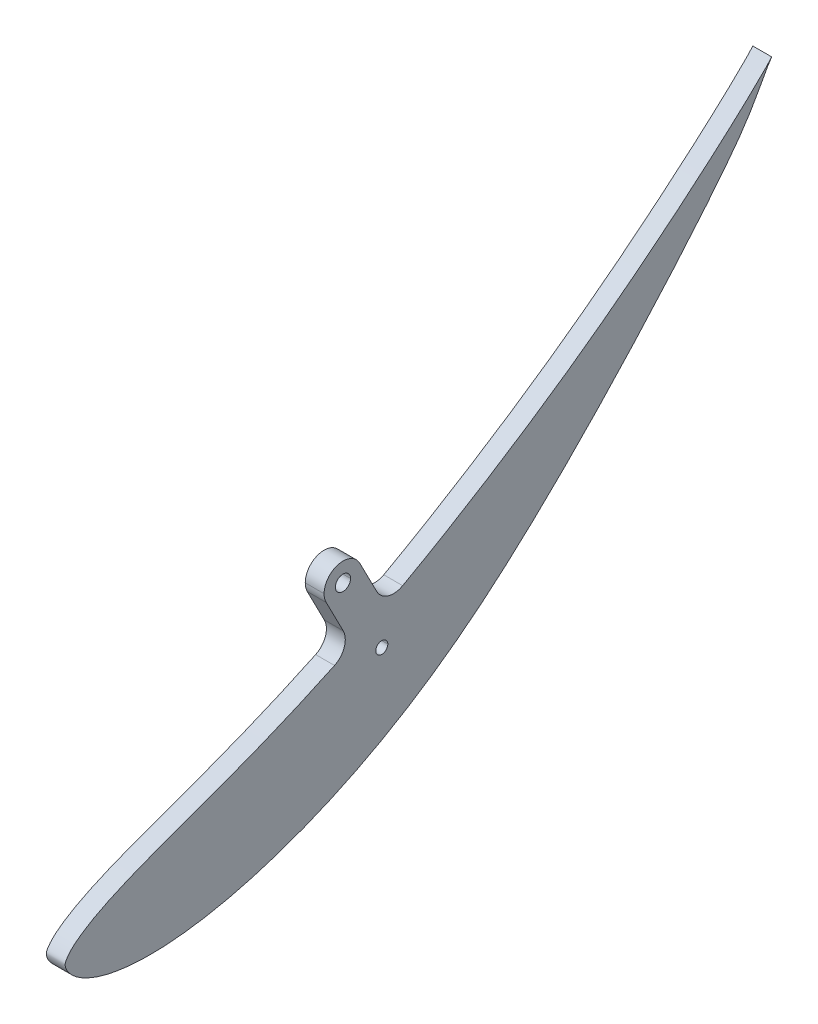
ISO-10303-21;
HEADER;
FILE_DESCRIPTION(('STEP AP214'),'2;1');
FILE_NAME('part.step','',(''),(''),'','','');
FILE_SCHEMA(('AUTOMOTIVE_DESIGN { 1 0 10303 214 1 1 1 1 }'));
ENDSEC;
DATA;
#1=APPLICATION_CONTEXT('core data for automotive mechanical design processes');
#2=APPLICATION_PROTOCOL_DEFINITION('international standard','automotive_design',2000,#1);
#3=PRODUCT_CONTEXT('',#1,'mechanical');
#4=PRODUCT('Part','Part','',(#3));
#5=PRODUCT_RELATED_PRODUCT_CATEGORY('part','',(#4));
#6=PRODUCT_DEFINITION_FORMATION('','',#4);
#7=PRODUCT_DEFINITION_CONTEXT('part definition',#1,'design');
#8=PRODUCT_DEFINITION('design','',#6,#7);
#9=PRODUCT_DEFINITION_SHAPE('','',#8);
#10=(LENGTH_UNIT() NAMED_UNIT(*) SI_UNIT(.MILLI.,.METRE.));
#11=(NAMED_UNIT(*) PLANE_ANGLE_UNIT() SI_UNIT($,.RADIAN.));
#12=(NAMED_UNIT(*) SI_UNIT($,.STERADIAN.) SOLID_ANGLE_UNIT());
#13=UNCERTAINTY_MEASURE_WITH_UNIT(LENGTH_MEASURE(1.E-05),#10,'distance_accuracy_value','');
#14=(GEOMETRIC_REPRESENTATION_CONTEXT(3) GLOBAL_UNCERTAINTY_ASSIGNED_CONTEXT((#13)) GLOBAL_UNIT_ASSIGNED_CONTEXT((#10,
#11,#12)) REPRESENTATION_CONTEXT('',''));
#15=CARTESIAN_POINT('',(0.,0.,0.));
#16=DIRECTION('',(0.,0.,1.));
#17=DIRECTION('',(1.,0.,0.));
#18=AXIS2_PLACEMENT_3D('',#15,#16,#17);
#19=CARTESIAN_POINT('',(-490.625999952,1029.97,-1002.03));
#20=DIRECTION('',(1.,0.,0.));
#21=DIRECTION('',(0.,0.,-1.));
#22=AXIS2_PLACEMENT_3D('',#19,#20,#21);
#23=CYLINDRICAL_SURFACE('',#22,2.01929999999994);
#24=DIRECTION('',(1.,0.,0.));
#25=VECTOR('',#24,1.);
#26=CARTESIAN_POINT('',(-490.625999952,1029.97,-1000.0107));
#27=LINE('',#26,#25);
#28=CARTESIAN_POINT('',(-3.175,1029.97,-1000.0107));
#29=VERTEX_POINT('',#28);
#30=CARTESIAN_POINT('',(3.175,1029.97,-1000.0107));
#31=VERTEX_POINT('',#30);
#32=EDGE_CURVE('E334',#29,#31,#27,.T.);
#33=ORIENTED_EDGE('',*,*,#32,.F.);
#34=CARTESIAN_POINT('',(-3.175,1029.97,-1002.03));
#35=DIRECTION('',(-1.,0.,0.));
#36=DIRECTION('',(0.,0.,-1.));
#37=AXIS2_PLACEMENT_3D('',#34,#35,#36);
#38=CIRCLE('',#37,2.01929999999994);
#39=CARTESIAN_POINT('',(-3.175,1029.97,-1004.0493));
#40=VERTEX_POINT('',#39);
#41=EDGE_CURVE('E11',#29,#40,#38,.T.);
#42=ORIENTED_EDGE('',*,*,#41,.T.);
#43=DIRECTION('',(1.,0.,0.));
#44=VECTOR('',#43,1.);
#45=CARTESIAN_POINT('',(-490.625999952,1029.97,-1004.0493));
#46=LINE('',#45,#44);
#47=CARTESIAN_POINT('',(3.175,1029.97,-1004.0493));
#48=VERTEX_POINT('',#47);
#49=EDGE_CURVE('E322',#40,#48,#46,.T.);
#50=ORIENTED_EDGE('',*,*,#49,.T.);
#51=CARTESIAN_POINT('',(3.175,1029.97,-1002.03));
#52=DIRECTION('',(1.,0.,0.));
#53=DIRECTION('',(0.,0.,-1.));
#54=AXIS2_PLACEMENT_3D('',#51,#52,#53);
#55=CIRCLE('',#54,2.01929999999994);
#56=EDGE_CURVE('E273',#48,#31,#55,.T.);
#57=ORIENTED_EDGE('',*,*,#56,.T.);
#58=EDGE_LOOP('',(#33,#42,#50,#57));
#59=FACE_BOUND('',#58,.T.);
#60=ADVANCED_FACE('F17',(#59),#23,.F.);
#61=CARTESIAN_POINT('',(0.,1038.43152102921,-983.391341109944));
#62=DIRECTION('',(-1.,0.,0.));
#63=DIRECTION('',(0.,0.,1.));
#64=AXIS2_PLACEMENT_3D('',#61,#62,#63);
#65=CYLINDRICAL_SURFACE('',#64,6.35);
#66=CARTESIAN_POINT('',(3.175,1038.43152102921,-983.391341109944));
#67=DIRECTION('',(-1.,0.,0.));
#68=DIRECTION('',(0.,0.,-1.));
#69=AXIS2_PLACEMENT_3D('',#66,#67,#68);
#70=CIRCLE('',#69,6.35);
#71=CARTESIAN_POINT('',(3.175,1041.33753556229,-989.037364447972));
#72=VERTEX_POINT('',#71);
#73=CARTESIAN_POINT('',(3.175,1032.69501889045,-986.114398805244));
#74=VERTEX_POINT('',#73);
#75=EDGE_CURVE('E155',#72,#74,#70,.T.);
#76=ORIENTED_EDGE('',*,*,#75,.F.);
#77=DIRECTION('',(1.,0.,0.));
#78=VECTOR('',#77,1.);
#79=CARTESIAN_POINT('',(3.175,1041.33753556229,-989.037364447972));
#80=LINE('',#79,#78);
#81=CARTESIAN_POINT('',(-3.175,1041.33753556229,-989.037364447972));
#82=VERTEX_POINT('',#81);
#83=EDGE_CURVE('E209',#82,#72,#80,.T.);
#84=ORIENTED_EDGE('',*,*,#83,.F.);
#85=CARTESIAN_POINT('',(-3.175,1038.43152102921,-983.391341109944));
#86=DIRECTION('',(1.,0.,0.));
#87=DIRECTION('',(0.,0.,-1.));
#88=AXIS2_PLACEMENT_3D('',#85,#86,#87);
#89=CIRCLE('',#88,6.35);
#90=CARTESIAN_POINT('',(-3.175,1032.69501889045,-986.114398805244));
#91=VERTEX_POINT('',#90);
#92=EDGE_CURVE('E25',#91,#82,#89,.T.);
#93=ORIENTED_EDGE('',*,*,#92,.F.);
#94=DIRECTION('',(-1.,0.,0.));
#95=VECTOR('',#94,1.);
#96=CARTESIAN_POINT('',(3.175,1032.69501889045,-986.114398805244));
#97=LINE('',#96,#95);
#98=EDGE_CURVE('E253',#74,#91,#97,.T.);
#99=ORIENTED_EDGE('',*,*,#98,.F.);
#100=EDGE_LOOP('',(#76,#84,#93,#99));
#101=FACE_BOUND('',#100,.T.);
#102=ADVANCED_FACE('F298',(#101),#65,.F.);
#103=CARTESIAN_POINT('',(0.,1050.04578660814,-1005.98047470024));
#104=DIRECTION('',(-1.,0.,0.));
#105=DIRECTION('',(0.,0.,1.));
#106=AXIS2_PLACEMENT_3D('',#103,#104,#105);
#107=CYLINDRICAL_SURFACE('',#106,6.35);
#108=CARTESIAN_POINT('',(3.175,1050.04578660814,-1005.98047470024));
#109=DIRECTION('',(-1.,0.,0.));
#110=DIRECTION('',(0.,0.,-1.));
#111=AXIS2_PLACEMENT_3D('',#108,#109,#110);
#112=CIRCLE('',#111,6.35000000000008);
#113=CARTESIAN_POINT('',(3.175,1044.48707475236,-1009.05020148033));
#114=VERTEX_POINT('',#113);
#115=CARTESIAN_POINT('',(3.175,1047.13977207507,-1000.33445136221));
#116=VERTEX_POINT('',#115);
#117=EDGE_CURVE('E49',#114,#116,#112,.T.);
#118=ORIENTED_EDGE('',*,*,#117,.F.);
#119=DIRECTION('',(1.,0.,0.));
#120=VECTOR('',#119,1.);
#121=CARTESIAN_POINT('',(-3.175,1044.48707475236,-1009.05020148033));
#122=LINE('',#121,#120);
#123=CARTESIAN_POINT('',(-3.175,1044.48707475236,-1009.05020148033));
#124=VERTEX_POINT('',#123);
#125=EDGE_CURVE('E182',#124,#114,#122,.T.);
#126=ORIENTED_EDGE('',*,*,#125,.F.);
#127=CARTESIAN_POINT('',(-3.175,1050.04578660814,-1005.98047470024));
#128=DIRECTION('',(1.,0.,0.));
#129=DIRECTION('',(0.,0.,-1.));
#130=AXIS2_PLACEMENT_3D('',#127,#128,#129);
#131=CIRCLE('',#130,6.35000000000008);
#132=CARTESIAN_POINT('',(-3.175,1047.13977207507,-1000.33445136221));
#133=VERTEX_POINT('',#132);
#134=EDGE_CURVE('E38',#133,#124,#131,.T.);
#135=ORIENTED_EDGE('',*,*,#134,.F.);
#136=DIRECTION('',(-1.,0.,0.));
#137=VECTOR('',#136,1.);
#138=CARTESIAN_POINT('',(3.175,1047.13977207507,-1000.33445136221));
#139=LINE('',#138,#137);
#140=EDGE_CURVE('E272',#116,#133,#139,.T.);
#141=ORIENTED_EDGE('',*,*,#140,.F.);
#142=EDGE_LOOP('',(#118,#126,#135,#141));
#143=FACE_BOUND('',#142,.T.);
#144=ADVANCED_FACE('F501',(#143),#107,.F.);
#145=CARTESIAN_POINT('',(-3.175,0.,0.));
#146=DIRECTION('',(1.,0.,0.));
#147=DIRECTION('',(0.,1.,0.));
#148=AXIS2_PLACEMENT_3D('',#145,#146,#147);
#149=PLANE('',#148);
#150=CARTESIAN_POINT('',(-3.175,1055.35569401965,-988.963954867594));
#151=DIRECTION('',(1.,0.,0.));
#152=DIRECTION('',(0.,0.,-1.));
#153=AXIS2_PLACEMENT_3D('',#150,#151,#152);
#154=CIRCLE('',#153,2.55269999999985);
#155=CARTESIAN_POINT('',(-3.175,1055.35569401965,-986.411254867594));
#156=VERTEX_POINT('',#155);
#157=CARTESIAN_POINT('',(-3.175,1055.35569401965,-991.516654867594));
#158=VERTEX_POINT('',#157);
#159=EDGE_CURVE('E150',#156,#158,#154,.T.);
#160=ORIENTED_EDGE('',*,*,#159,.T.);
#161=CARTESIAN_POINT('',(-3.175,1055.35569401965,-988.963954867594));
#162=DIRECTION('',(1.,0.,0.));
#163=DIRECTION('',(0.,0.,-1.));
#164=AXIS2_PLACEMENT_3D('',#161,#162,#163);
#165=CIRCLE('',#164,2.55269999999985);
#166=EDGE_CURVE('E145',#158,#156,#165,.T.);
#167=ORIENTED_EDGE('',*,*,#166,.T.);
#168=EDGE_LOOP('',(#160,#167));
#169=FACE_BOUND('',#168,.T.);
#170=CARTESIAN_POINT('',(-3.175,1029.97,-1002.03));
#171=DIRECTION('',(-1.,0.,0.));
#172=DIRECTION('',(0.,0.,-1.));
#173=AXIS2_PLACEMENT_3D('',#170,#171,#172);
#174=CIRCLE('',#173,2.01929999999994);
#175=EDGE_CURVE('E342',#40,#29,#174,.T.);
#176=ORIENTED_EDGE('',*,*,#175,.F.);
#177=ORIENTED_EDGE('',*,*,#41,.F.);
#178=EDGE_LOOP('',(#176,#177));
#179=FACE_BOUND('',#178,.T.);
#180=CARTESIAN_POINT('',(-3.175,1055.35569401965,-988.963954867594));
#181=DIRECTION('',(1.,0.,0.));
#182=DIRECTION('',(0.,0.,-1.));
#183=AXIS2_PLACEMENT_3D('',#180,#181,#182);
#184=CIRCLE('',#183,6.34999999999986);
#185=CARTESIAN_POINT('',(-3.175,1058.26170855273,-994.609978205623));
#186=VERTEX_POINT('',#185);
#187=CARTESIAN_POINT('',(-3.175,1055.35569401965,-982.613954867594));
#188=VERTEX_POINT('',#187);
#189=EDGE_CURVE('E242',#186,#188,#184,.T.);
#190=ORIENTED_EDGE('',*,*,#189,.F.);
#191=DIRECTION('',(0.,-0.889137533547774,-0.457640083948708));
#192=VECTOR('',#191,1.);
#193=CARTESIAN_POINT('',(-3.175,626.348203924365,-1216.91634258551));
#194=LINE('',#193,#192);
#195=EDGE_CURVE('E279',#186,#133,#194,.T.);
#196=ORIENTED_EDGE('',*,*,#195,.T.);
#197=ORIENTED_EDGE('',*,*,#134,.T.);
#198=CARTESIAN_POINT('',(-3.175,1136.500000046,-1133.2478951966));
#199=CARTESIAN_POINT('',(-3.175,1136.51866205503,-1133.22940707));
#200=CARTESIAN_POINT('',(-3.175,1134.76729407548,-1131.73738322467));
#201=CARTESIAN_POINT('',(-3.175,1133.14865361785,-1130.04521312581));
#202=CARTESIAN_POINT('',(-3.175,1129.16246906123,-1126.03283655878));
#203=CARTESIAN_POINT('',(-3.175,1124.47580071429,-1120.93333634314));
#204=CARTESIAN_POINT('',(-3.175,1118.44426676079,-1114.21213755127));
#205=CARTESIAN_POINT('',(-3.175,1111.46914157634,-1106.14181380977));
#206=CARTESIAN_POINT('',(-3.175,1103.59085152631,-1096.66531267338));
#207=CARTESIAN_POINT('',(-3.175,1094.99661592395,-1085.87423454851));
#208=CARTESIAN_POINT('',(-3.175,1085.8664057438,-1073.8426942592));
#209=CARTESIAN_POINT('',(-3.175,1076.45564659389,-1060.67966671591));
#210=CARTESIAN_POINT('',(-3.175,1066.99203007372,-1046.56526822842));
#211=CARTESIAN_POINT('',(-3.175,1057.62710879863,-1031.73778080715));
#212=CARTESIAN_POINT('',(-3.175,1050.14861006831,-1019.14642604003));
#213=CARTESIAN_POINT('',(-3.175,1045.84195399569,-1011.50363914843));
#214=CARTESIAN_POINT('',(-3.175,1044.48707475236,-1009.05020148033));
#215=(BOUNDED_CURVE() B_SPLINE_CURVE(3,(#198,#199,#200,#201,#202,#203,#204,#205,#206,#207,#208,
#209,#210,#211,#212,#213,#214),.UNSPECIFIED.,.F.,.F.) B_SPLINE_CURVE_WITH_KNOTS((4,1,1,1,1,1,1,
1,1,1,1,1,1,1,4),(0.,0.00184117619079416,0.00730848433221432,0.016237150684669,
0.0284563248120514,0.0438013684366982,0.0621258274692258,0.0832395532130718,0.106895519252796,
0.132816624078713,0.160612712000671,0.189791010160819,0.219873156169979,0.250457487037601,
0.264816751171415),
.UNSPECIFIED.) CURVE() GEOMETRIC_REPRESENTATION_ITEM() RATIONAL_B_SPLINE_CURVE((1.,1.,1.,1.,1.,
1.,1.,1.,1.,1.,1.,1.,1.,1.,1.,1.,1.)) REPRESENTATION_ITEM(''));
#216=CARTESIAN_POINT('',(-3.175,1136.500000046,-1133.2478951966));
#217=VERTEX_POINT('',#216);
#218=EDGE_CURVE('E178',#217,#124,#215,.T.);
#219=ORIENTED_EDGE('',*,*,#218,.F.);
#220=CARTESIAN_POINT('',(-3.175,983.23183406811,-902.866032271416));
#221=CARTESIAN_POINT('',(-3.175,983.051794016204,-903.245654519471));
#222=CARTESIAN_POINT('',(-3.175,982.193962185146,-905.174738908225));
#223=CARTESIAN_POINT('',(-3.175,980.947491558145,-909.044621195438));
#224=CARTESIAN_POINT('',(-3.175,979.870416154282,-914.795542365219));
#225=CARTESIAN_POINT('',(-3.175,979.346135741337,-921.395591653794));
#226=CARTESIAN_POINT('',(-3.175,979.429810957453,-928.776843337677));
#227=CARTESIAN_POINT('',(-3.175,980.159041889332,-936.860781778271));
#228=CARTESIAN_POINT('',(-3.175,981.563117839808,-945.564210018201));
#229=CARTESIAN_POINT('',(-3.175,983.658288216997,-954.794977359482));
#230=CARTESIAN_POINT('',(-3.175,986.455957132716,-964.453768835694));
#231=CARTESIAN_POINT('',(-3.175,989.95151803178,-974.43570168517));
#232=CARTESIAN_POINT('',(-3.175,994.146079418227,-984.631289751938));
#233=CARTESIAN_POINT('',(-3.175,999.067064719455,-994.928463859717));
#234=CARTESIAN_POINT('',(-3.175,1004.71077269264,-1005.23476562102));
#235=CARTESIAN_POINT('',(-3.175,1011.06861436425,-1015.47490404744));
#236=CARTESIAN_POINT('',(-3.175,1018.12967538531,-1025.5791208222));
#237=CARTESIAN_POINT('',(-3.175,1025.88232833701,-1035.50248612597));
#238=CARTESIAN_POINT('',(-3.175,1034.28184113422,-1045.21746008474));
#239=CARTESIAN_POINT('',(-3.175,1043.15012909835,-1054.77205505592));
#240=CARTESIAN_POINT('',(-3.175,1052.32466752318,-1064.1447414051));
#241=CARTESIAN_POINT('',(-3.175,1061.65160830308,-1073.25399801771));
#242=CARTESIAN_POINT('',(-3.175,1070.96289931065,-1082.02526393335));
#243=CARTESIAN_POINT('',(-3.175,1080.09941585938,-1090.37127690747));
#244=CARTESIAN_POINT('',(-3.175,1088.91431720843,-1098.19257457962));
#245=CARTESIAN_POINT('',(-3.175,1097.26041144891,-1105.39647498838));
#246=CARTESIAN_POINT('',(-3.175,1105.00816359892,-1111.87692251879));
#247=CARTESIAN_POINT('',(-3.175,1112.05162823055,-1117.54059155859));
#248=CARTESIAN_POINT('',(-3.175,1118.31282016739,-1122.28985209627));
#249=CARTESIAN_POINT('',(-3.175,1123.94756936492,-1126.05528055917));
#250=CARTESIAN_POINT('',(-3.175,1128.69826829572,-1128.73587721306));
#251=CARTESIAN_POINT('',(-3.175,1132.83122267032,-1131.03774052774));
#252=CARTESIAN_POINT('',(-3.175,1134.71203322922,-1132.01470797932));
#253=CARTESIAN_POINT('',(-3.175,1136.48162676212,-1133.26609728824));
#254=CARTESIAN_POINT('',(-3.175,1136.500000046,-1133.2478951966));
#255=(BOUNDED_CURVE() B_SPLINE_CURVE(3,(#220,#221,#222,#223,#224,#225,#226,#227,#228,#229,#230,
#231,#232,#233,#234,#235,#236,#237,#238,#239,#240,#241,#242,#243,#244,#245,#246,#247,#248,#249,
#250,#251,#252,#253,#254),.UNSPECIFIED.,.F.,.F.) B_SPLINE_CURVE_WITH_KNOTS((4,1,1,1,1,1,1,1,1,1,
1,1,1,1,1,1,1,1,1,1,1,1,1,1,1,1,1,1,1,1,1,1,4),(0.5,0.50214941417673,0.51079641033661,
0.52076411711489,0.532061880680993,0.544665778051845,0.558541303758952,0.573611819486058,
0.589802913486935,0.607010013605937,0.625106991651802,0.643966630087001,0.663469283837628,
0.683551422114583,0.704141715386998,0.725196116617036,0.746680344678811,0.76863295082579,
0.790977273416519,0.813463266282734,0.835826600861633,0.857771602761782,0.879002654996971,
0.899227861132971,0.918150719215499,0.935487384590744,0.950986920125746,0.964427757613896,
0.97582785740124,0.985423652020086,0.993088671814056,0.998187309160131,1.),
.UNSPECIFIED.) CURVE() GEOMETRIC_REPRESENTATION_ITEM() RATIONAL_B_SPLINE_CURVE((1.,1.,1.,1.,1.,
1.,1.,1.,1.,1.,1.,1.,1.,1.,1.,1.,1.,1.,1.,1.,1.,1.,1.,1.,1.,1.,1.,1.,1.,1.,1.,1.,1.,1.,1.)) REPRESENTATION_ITEM(''));
#256=CARTESIAN_POINT('',(-3.175,983.23183406811,-902.866032271416));
#257=VERTEX_POINT('',#256);
#258=EDGE_CURVE('E187',#257,#217,#255,.T.);
#259=ORIENTED_EDGE('',*,*,#258,.F.);
#260=CARTESIAN_POINT('',(-3.175,1032.69501889045,-986.114398805244));
#261=CARTESIAN_POINT('',(-3.175,1032.49497868821,-985.692986122752));
#262=CARTESIAN_POINT('',(-3.175,1029.89901787888,-980.198891522425));
#263=CARTESIAN_POINT('',(-3.175,1025.31827723405,-969.885579530069));
#264=CARTESIAN_POINT('',(-3.175,1019.49450613905,-955.489755196973));
#265=CARTESIAN_POINT('',(-3.175,1014.57372401878,-942.326496264695));
#266=CARTESIAN_POINT('',(-3.175,1010.42738715633,-930.668912346977));
#267=CARTESIAN_POINT('',(-3.175,1006.73545630894,-920.709876051195));
#268=CARTESIAN_POINT('',(-3.175,1003.30962973556,-912.488425414251));
#269=CARTESIAN_POINT('',(-3.175,1000.11328499534,-905.924711836648));
#270=CARTESIAN_POINT('',(-3.175,997.12209295586,-900.987613441477));
#271=CARTESIAN_POINT('',(-3.175,994.848485081599,-898.105542312802));
#272=CARTESIAN_POINT('',(-3.175,993.323061343934,-896.747220150379));
#273=CARTESIAN_POINT('',(-3.175,992.695678509163,-896.262963388353));
#274=CARTESIAN_POINT('',(-3.175,992.128471885305,-895.906132308792));
#275=CARTESIAN_POINT('',(-3.175,991.74202912273,-895.703357721575));
#276=CARTESIAN_POINT('',(-3.175,991.439913457428,-895.58976608859));
#277=CARTESIAN_POINT('',(-3.175,991.228782623257,-895.522464552237));
#278=CARTESIAN_POINT('',(-3.175,991.020214241511,-895.477266270503));
#279=CARTESIAN_POINT('',(-3.175,990.810606980497,-895.468104938629));
#280=CARTESIAN_POINT('',(-3.175,990.597176067395,-895.477187864337));
#281=CARTESIAN_POINT('',(-3.175,990.302571432088,-895.521281629362));
#282=CARTESIAN_POINT('',(-3.175,989.921640587498,-895.605761956951));
#283=CARTESIAN_POINT('',(-3.175,989.376327617136,-895.801661540054));
#284=CARTESIAN_POINT('',(-3.175,988.324502311541,-896.307224772996));
#285=CARTESIAN_POINT('',(-3.175,986.580020905351,-897.682020107552));
#286=CARTESIAN_POINT('',(-3.175,984.731799572414,-900.007794247464));
#287=CARTESIAN_POINT('',(-3.175,983.666890362432,-901.948697229946));
#288=CARTESIAN_POINT('',(-3.175,983.23183406811,-902.866032271416));
#289=(BOUNDED_CURVE() B_SPLINE_CURVE(3,(#260,#261,#262,#263,#264,#265,#266,#267,#268,#269,#270,
#271,#272,#273,#274,#275,#276,#277,#278,#279,#280,#281,#282,#283,#284,#285,#286,#287,#288),
.UNSPECIFIED.,.F.,.F.) B_SPLINE_CURVE_WITH_KNOTS((4,1,1,1,1,1,1,1,1,1,1,1,1,1,1,1,1,1,1,1,1,1,1,
1,1,1,4),(0.308866622963246,0.311256566368928,0.339998753430789,0.366671480309786,
0.390812035384013,0.411995107228008,0.430068720119567,0.445223789458553,0.457619352285403,
0.467425396221126,0.474786479626527,0.476279684730584,0.477883716925066,0.478839791717239,
0.479711359314481,0.480113154439697,0.480492023942477,0.48084645603417,0.481202586512776,
0.481563638127212,0.481939611769679,0.482727347846705,0.483558571629405,0.484902837311291,
0.488691658546686,0.494806065890377,0.5),
.UNSPECIFIED.) CURVE() GEOMETRIC_REPRESENTATION_ITEM() RATIONAL_B_SPLINE_CURVE((1.,1.,1.,1.,1.,
1.,1.,1.,1.,1.,1.,1.,1.,1.,1.,1.,1.,1.,1.,1.,1.,1.,1.,1.,1.,1.,1.,1.,1.)) REPRESENTATION_ITEM(''));
#290=EDGE_CURVE('E260',#91,#257,#289,.T.);
#291=ORIENTED_EDGE('',*,*,#290,.F.);
#292=ORIENTED_EDGE('',*,*,#92,.T.);
#293=DIRECTION('',(0.,-0.889137533547753,-0.45764008394875));
#294=VECTOR('',#293,1.);
#295=CARTESIAN_POINT('',(-3.175,620.536174858283,-1205.62429590944));
#296=LINE('',#295,#294);
#297=CARTESIAN_POINT('',(-3.175,1052.44967948658,-983.317931529566));
#298=VERTEX_POINT('',#297);
#299=EDGE_CURVE('E214',#298,#82,#296,.T.);
#300=ORIENTED_EDGE('',*,*,#299,.F.);
#301=CARTESIAN_POINT('',(-3.175,1055.35569401965,-988.963954867594));
#302=DIRECTION('',(1.,0.,0.));
#303=DIRECTION('',(0.,0.,-1.));
#304=AXIS2_PLACEMENT_3D('',#301,#302,#303);
#305=CIRCLE('',#304,6.34999999999986);
#306=EDGE_CURVE('E230',#188,#298,#305,.T.);
#307=ORIENTED_EDGE('',*,*,#306,.F.);
#308=EDGE_LOOP('',(#190,#196,#197,#219,#259,#291,#292,#300,#307));
#309=FACE_BOUND('',#308,.T.);
#310=ADVANCED_FACE('F147',(#169,#179,#309),#149,.F.);
#311=CARTESIAN_POINT('',(3.175,0.,0.));
#312=DIRECTION('',(1.,0.,0.));
#313=DIRECTION('',(0.,1.,0.));
#314=AXIS2_PLACEMENT_3D('',#311,#312,#313);
#315=PLANE('',#314);
#316=CARTESIAN_POINT('',(3.175,1055.35569401965,-988.963954867594));
#317=DIRECTION('',(1.,0.,0.));
#318=DIRECTION('',(0.,0.,-1.));
#319=AXIS2_PLACEMENT_3D('',#316,#317,#318);
#320=CIRCLE('',#319,2.55269999999985);
#321=CARTESIAN_POINT('',(3.175,1055.35569401965,-986.411254867594));
#322=VERTEX_POINT('',#321);
#323=CARTESIAN_POINT('',(3.175,1055.35569401965,-991.516654867594));
#324=VERTEX_POINT('',#323);
#325=EDGE_CURVE('E175',#322,#324,#320,.T.);
#326=ORIENTED_EDGE('',*,*,#325,.F.);
#327=CARTESIAN_POINT('',(3.175,1055.35569401965,-988.963954867594));
#328=DIRECTION('',(1.,0.,0.));
#329=DIRECTION('',(0.,0.,-1.));
#330=AXIS2_PLACEMENT_3D('',#327,#328,#329);
#331=CIRCLE('',#330,2.55269999999985);
#332=EDGE_CURVE('E156',#324,#322,#331,.T.);
#333=ORIENTED_EDGE('',*,*,#332,.F.);
#334=EDGE_LOOP('',(#326,#333));
#335=FACE_BOUND('',#334,.T.);
#336=ORIENTED_EDGE('',*,*,#56,.F.);
#337=CARTESIAN_POINT('',(3.175,1029.97,-1002.03));
#338=DIRECTION('',(1.,0.,0.));
#339=DIRECTION('',(0.,0.,-1.));
#340=AXIS2_PLACEMENT_3D('',#337,#338,#339);
#341=CIRCLE('',#340,2.01929999999994);
#342=EDGE_CURVE('E327',#31,#48,#341,.T.);
#343=ORIENTED_EDGE('',*,*,#342,.F.);
#344=EDGE_LOOP('',(#336,#343));
#345=FACE_BOUND('',#344,.T.);
#346=CARTESIAN_POINT('',(3.175,1055.35569401965,-988.963954867594));
#347=DIRECTION('',(1.,0.,0.));
#348=DIRECTION('',(0.,0.,-1.));
#349=AXIS2_PLACEMENT_3D('',#346,#347,#348);
#350=CIRCLE('',#349,6.34999999999986);
#351=CARTESIAN_POINT('',(3.175,1058.26170855273,-994.609978205623));
#352=VERTEX_POINT('',#351);
#353=CARTESIAN_POINT('',(3.175,1055.35569401965,-982.613954867594));
#354=VERTEX_POINT('',#353);
#355=EDGE_CURVE('E238',#352,#354,#350,.T.);
#356=ORIENTED_EDGE('',*,*,#355,.T.);
#357=CARTESIAN_POINT('',(3.175,1055.35569401965,-988.963954867594));
#358=DIRECTION('',(1.,0.,0.));
#359=DIRECTION('',(0.,0.,-1.));
#360=AXIS2_PLACEMENT_3D('',#357,#358,#359);
#361=CIRCLE('',#360,6.34999999999986);
#362=CARTESIAN_POINT('',(3.175,1052.44967948658,-983.317931529566));
#363=VERTEX_POINT('',#362);
#364=EDGE_CURVE('E185',#354,#363,#361,.T.);
#365=ORIENTED_EDGE('',*,*,#364,.T.);
#366=DIRECTION('',(0.,-0.889137533547753,-0.45764008394875));
#367=VECTOR('',#366,1.);
#368=CARTESIAN_POINT('',(3.175,620.536174858283,-1205.62429590944));
#369=LINE('',#368,#367);
#370=EDGE_CURVE('E213',#363,#72,#369,.T.);
#371=ORIENTED_EDGE('',*,*,#370,.T.);
#372=ORIENTED_EDGE('',*,*,#75,.T.);
#373=CARTESIAN_POINT('',(3.175,1032.69501889045,-986.114398805244));
#374=CARTESIAN_POINT('',(3.175,1032.49497868821,-985.692986122752));
#375=CARTESIAN_POINT('',(3.175,1029.89901787888,-980.198891522425));
#376=CARTESIAN_POINT('',(3.175,1025.31827723405,-969.885579530069));
#377=CARTESIAN_POINT('',(3.175,1019.49450613905,-955.489755196973));
#378=CARTESIAN_POINT('',(3.175,1014.57372401878,-942.326496264695));
#379=CARTESIAN_POINT('',(3.175,1010.42738715633,-930.668912346977));
#380=CARTESIAN_POINT('',(3.175,1006.73545630894,-920.709876051195));
#381=CARTESIAN_POINT('',(3.175,1003.30962973556,-912.488425414251));
#382=CARTESIAN_POINT('',(3.175,1000.11328499534,-905.924711836648));
#383=CARTESIAN_POINT('',(3.175,997.12209295586,-900.987613441477));
#384=CARTESIAN_POINT('',(3.175,994.848485081599,-898.105542312802));
#385=CARTESIAN_POINT('',(3.175,993.323061343934,-896.747220150379));
#386=CARTESIAN_POINT('',(3.175,992.695678509163,-896.262963388353));
#387=CARTESIAN_POINT('',(3.175,992.128471885305,-895.906132308792));
#388=CARTESIAN_POINT('',(3.175,991.74202912273,-895.703357721575));
#389=CARTESIAN_POINT('',(3.175,991.439913457428,-895.58976608859));
#390=CARTESIAN_POINT('',(3.175,991.228782623257,-895.522464552237));
#391=CARTESIAN_POINT('',(3.175,991.020214241511,-895.477266270503));
#392=CARTESIAN_POINT('',(3.175,990.810606980497,-895.468104938629));
#393=CARTESIAN_POINT('',(3.175,990.597176067395,-895.477187864337));
#394=CARTESIAN_POINT('',(3.175,990.302571432088,-895.521281629362));
#395=CARTESIAN_POINT('',(3.175,989.921640587498,-895.605761956951));
#396=CARTESIAN_POINT('',(3.175,989.376327617136,-895.801661540054));
#397=CARTESIAN_POINT('',(3.175,988.324502311541,-896.307224772996));
#398=CARTESIAN_POINT('',(3.175,986.580020905351,-897.682020107552));
#399=CARTESIAN_POINT('',(3.175,984.731799572414,-900.007794247464));
#400=CARTESIAN_POINT('',(3.175,983.666890362432,-901.948697229946));
#401=CARTESIAN_POINT('',(3.175,983.23183406811,-902.866032271416));
#402=(BOUNDED_CURVE() B_SPLINE_CURVE(3,(#373,#374,#375,#376,#377,#378,#379,#380,#381,#382,#383,
#384,#385,#386,#387,#388,#389,#390,#391,#392,#393,#394,#395,#396,#397,#398,#399,#400,#401),
.UNSPECIFIED.,.F.,.F.) B_SPLINE_CURVE_WITH_KNOTS((4,1,1,1,1,1,1,1,1,1,1,1,1,1,1,1,1,1,1,1,1,1,1,
1,1,1,4),(0.308866622963246,0.311256566368928,0.339998753430789,0.366671480309786,
0.390812035384013,0.411995107228008,0.430068720119567,0.445223789458553,0.457619352285403,
0.467425396221126,0.474786479626527,0.476279684730584,0.477883716925066,0.478839791717239,
0.479711359314481,0.480113154439697,0.480492023942477,0.48084645603417,0.481202586512776,
0.481563638127212,0.481939611769679,0.482727347846705,0.483558571629405,0.484902837311291,
0.488691658546686,0.494806065890377,0.5),
.UNSPECIFIED.) CURVE() GEOMETRIC_REPRESENTATION_ITEM() RATIONAL_B_SPLINE_CURVE((1.,1.,1.,1.,1.,
1.,1.,1.,1.,1.,1.,1.,1.,1.,1.,1.,1.,1.,1.,1.,1.,1.,1.,1.,1.,1.,1.,1.,1.)) REPRESENTATION_ITEM(''));
#403=CARTESIAN_POINT('',(3.175,983.23183406811,-902.866032271416));
#404=VERTEX_POINT('',#403);
#405=EDGE_CURVE('E248',#74,#404,#402,.T.);
#406=ORIENTED_EDGE('',*,*,#405,.T.);
#407=CARTESIAN_POINT('',(3.175,983.23183406811,-902.866032271416));
#408=CARTESIAN_POINT('',(3.175,983.051794016204,-903.245654519471));
#409=CARTESIAN_POINT('',(3.175,982.193962185146,-905.174738908225));
#410=CARTESIAN_POINT('',(3.175,980.947491558145,-909.044621195438));
#411=CARTESIAN_POINT('',(3.175,979.870416154282,-914.795542365219));
#412=CARTESIAN_POINT('',(3.175,979.346135741337,-921.395591653794));
#413=CARTESIAN_POINT('',(3.175,979.429810957453,-928.776843337677));
#414=CARTESIAN_POINT('',(3.175,980.159041889332,-936.860781778271));
#415=CARTESIAN_POINT('',(3.175,981.563117839808,-945.564210018201));
#416=CARTESIAN_POINT('',(3.175,983.658288216997,-954.794977359482));
#417=CARTESIAN_POINT('',(3.175,986.455957132716,-964.453768835694));
#418=CARTESIAN_POINT('',(3.175,989.95151803178,-974.43570168517));
#419=CARTESIAN_POINT('',(3.175,994.146079418227,-984.631289751938));
#420=CARTESIAN_POINT('',(3.175,999.067064719455,-994.928463859717));
#421=CARTESIAN_POINT('',(3.175,1004.71077269264,-1005.23476562102));
#422=CARTESIAN_POINT('',(3.175,1011.06861436425,-1015.47490404744));
#423=CARTESIAN_POINT('',(3.175,1018.12967538531,-1025.5791208222));
#424=CARTESIAN_POINT('',(3.175,1025.88232833701,-1035.50248612597));
#425=CARTESIAN_POINT('',(3.175,1034.28184113422,-1045.21746008474));
#426=CARTESIAN_POINT('',(3.175,1043.15012909835,-1054.77205505592));
#427=CARTESIAN_POINT('',(3.175,1052.32466752318,-1064.1447414051));
#428=CARTESIAN_POINT('',(3.175,1061.65160830308,-1073.25399801771));
#429=CARTESIAN_POINT('',(3.175,1070.96289931065,-1082.02526393335));
#430=CARTESIAN_POINT('',(3.175,1080.09941585938,-1090.37127690747));
#431=CARTESIAN_POINT('',(3.175,1088.91431720843,-1098.19257457962));
#432=CARTESIAN_POINT('',(3.175,1097.26041144891,-1105.39647498838));
#433=CARTESIAN_POINT('',(3.175,1105.00816359892,-1111.87692251879));
#434=CARTESIAN_POINT('',(3.175,1112.05162823055,-1117.54059155859));
#435=CARTESIAN_POINT('',(3.175,1118.31282016739,-1122.28985209627));
#436=CARTESIAN_POINT('',(3.175,1123.94756936492,-1126.05528055917));
#437=CARTESIAN_POINT('',(3.175,1128.69826829572,-1128.73587721306));
#438=CARTESIAN_POINT('',(3.175,1132.83122267032,-1131.03774052774));
#439=CARTESIAN_POINT('',(3.175,1134.71203322922,-1132.01470797932));
#440=CARTESIAN_POINT('',(3.175,1136.48162676212,-1133.26609728824));
#441=CARTESIAN_POINT('',(3.175,1136.500000046,-1133.2478951966));
#442=(BOUNDED_CURVE() B_SPLINE_CURVE(3,(#407,#408,#409,#410,#411,#412,#413,#414,#415,#416,#417,
#418,#419,#420,#421,#422,#423,#424,#425,#426,#427,#428,#429,#430,#431,#432,#433,#434,#435,#436,
#437,#438,#439,#440,#441),.UNSPECIFIED.,.F.,.F.) B_SPLINE_CURVE_WITH_KNOTS((4,1,1,1,1,1,1,1,1,1,
1,1,1,1,1,1,1,1,1,1,1,1,1,1,1,1,1,1,1,1,1,1,4),(0.5,0.50214941417673,0.51079641033661,
0.52076411711489,0.532061880680993,0.544665778051845,0.558541303758952,0.573611819486058,
0.589802913486935,0.607010013605937,0.625106991651802,0.643966630087001,0.663469283837628,
0.683551422114583,0.704141715386998,0.725196116617036,0.746680344678811,0.76863295082579,
0.790977273416519,0.813463266282734,0.835826600861633,0.857771602761782,0.879002654996971,
0.899227861132971,0.918150719215499,0.935487384590744,0.950986920125746,0.964427757613896,
0.97582785740124,0.985423652020086,0.993088671814056,0.998187309160131,1.),
.UNSPECIFIED.) CURVE() GEOMETRIC_REPRESENTATION_ITEM() RATIONAL_B_SPLINE_CURVE((1.,1.,1.,1.,1.,
1.,1.,1.,1.,1.,1.,1.,1.,1.,1.,1.,1.,1.,1.,1.,1.,1.,1.,1.,1.,1.,1.,1.,1.,1.,1.,1.,1.,1.,1.)) REPRESENTATION_ITEM(''));
#443=CARTESIAN_POINT('',(3.175,1136.500000046,-1133.2478951966));
#444=VERTEX_POINT('',#443);
#445=EDGE_CURVE('E165',#404,#444,#442,.T.);
#446=ORIENTED_EDGE('',*,*,#445,.T.);
#447=CARTESIAN_POINT('',(3.175,1136.500000046,-1133.2478951966));
#448=CARTESIAN_POINT('',(3.175,1136.51866205503,-1133.22940707));
#449=CARTESIAN_POINT('',(3.175,1134.76729407548,-1131.73738322467));
#450=CARTESIAN_POINT('',(3.175,1133.14865361785,-1130.04521312581));
#451=CARTESIAN_POINT('',(3.175,1129.16246906123,-1126.03283655878));
#452=CARTESIAN_POINT('',(3.175,1124.47580071429,-1120.93333634314));
#453=CARTESIAN_POINT('',(3.175,1118.44426676079,-1114.21213755127));
#454=CARTESIAN_POINT('',(3.175,1111.46914157634,-1106.14181380977));
#455=CARTESIAN_POINT('',(3.175,1103.59085152631,-1096.66531267338));
#456=CARTESIAN_POINT('',(3.175,1094.99661592395,-1085.87423454851));
#457=CARTESIAN_POINT('',(3.175,1085.8664057438,-1073.8426942592));
#458=CARTESIAN_POINT('',(3.175,1076.45564659389,-1060.67966671591));
#459=CARTESIAN_POINT('',(3.175,1066.99203007372,-1046.56526822842));
#460=CARTESIAN_POINT('',(3.175,1057.62710879863,-1031.73778080715));
#461=CARTESIAN_POINT('',(3.175,1050.14861006831,-1019.14642604003));
#462=CARTESIAN_POINT('',(3.175,1045.84195399569,-1011.50363914843));
#463=CARTESIAN_POINT('',(3.175,1044.48707475236,-1009.05020148033));
#464=(BOUNDED_CURVE() B_SPLINE_CURVE(3,(#447,#448,#449,#450,#451,#452,#453,#454,#455,#456,#457,
#458,#459,#460,#461,#462,#463),.UNSPECIFIED.,.F.,.F.) B_SPLINE_CURVE_WITH_KNOTS((4,1,1,1,1,1,1,
1,1,1,1,1,1,1,4),(0.,0.00184117619079416,0.00730848433221432,0.016237150684669,
0.0284563248120514,0.0438013684366982,0.0621258274692258,0.0832395532130718,0.106895519252796,
0.132816624078713,0.160612712000671,0.189791010160819,0.219873156169979,0.250457487037601,
0.264816751171415),
.UNSPECIFIED.) CURVE() GEOMETRIC_REPRESENTATION_ITEM() RATIONAL_B_SPLINE_CURVE((1.,1.,1.,1.,1.,
1.,1.,1.,1.,1.,1.,1.,1.,1.,1.,1.,1.)) REPRESENTATION_ITEM(''));
#465=EDGE_CURVE('E218',#444,#114,#464,.T.);
#466=ORIENTED_EDGE('',*,*,#465,.T.);
#467=ORIENTED_EDGE('',*,*,#117,.T.);
#468=DIRECTION('',(0.,-0.889137533547774,-0.457640083948708));
#469=VECTOR('',#468,1.);
#470=CARTESIAN_POINT('',(3.175,626.348203924365,-1216.91634258551));
#471=LINE('',#470,#469);
#472=EDGE_CURVE('E265',#352,#116,#471,.T.);
#473=ORIENTED_EDGE('',*,*,#472,.F.);
#474=EDGE_LOOP('',(#356,#365,#371,#372,#406,#446,#466,#467,#473));
#475=FACE_BOUND('',#474,.T.);
#476=ADVANCED_FACE('F518',(#335,#345,#475),#315,.T.);
#477=CARTESIAN_POINT('',(3.175,1055.35569401965,-988.963954867594));
#478=DIRECTION('',(-1.,0.,0.));
#479=DIRECTION('',(0.,0.,1.));
#480=AXIS2_PLACEMENT_3D('',#477,#478,#479);
#481=CYLINDRICAL_SURFACE('',#480,2.55269999999985);
#482=DIRECTION('',(-1.,0.,0.));
#483=VECTOR('',#482,1.);
#484=CARTESIAN_POINT('',(3.175,1055.35569401965,-991.516654867594));
#485=LINE('',#484,#483);
#486=EDGE_CURVE('E168',#324,#158,#485,.T.);
#487=ORIENTED_EDGE('',*,*,#486,.F.);
#488=ORIENTED_EDGE('',*,*,#332,.T.);
#489=DIRECTION('',(-1.,0.,0.));
#490=VECTOR('',#489,1.);
#491=CARTESIAN_POINT('',(3.175,1055.35569401965,-986.411254867594));
#492=LINE('',#491,#490);
#493=EDGE_CURVE('E159',#322,#156,#492,.T.);
#494=ORIENTED_EDGE('',*,*,#493,.T.);
#495=ORIENTED_EDGE('',*,*,#166,.F.);
#496=EDGE_LOOP('',(#487,#488,#494,#495));
#497=FACE_BOUND('',#496,.T.);
#498=ADVANCED_FACE('F160',(#497),#481,.F.);
#499=CARTESIAN_POINT('',(3.175,626.348203924365,-1216.91634258551));
#500=DIRECTION('',(0.,0.457640083948708,-0.889137533547774));
#501=DIRECTION('',(-1.,0.,0.));
#502=AXIS2_PLACEMENT_3D('',#499,#500,#501);
#503=PLANE('',#502);
#504=ORIENTED_EDGE('',*,*,#472,.T.);
#505=ORIENTED_EDGE('',*,*,#140,.T.);
#506=ORIENTED_EDGE('',*,*,#195,.F.);
#507=DIRECTION('',(-1.,0.,0.));
#508=VECTOR('',#507,1.);
#509=CARTESIAN_POINT('',(3.175,1058.26170855273,-994.609978205623));
#510=LINE('',#509,#508);
#511=EDGE_CURVE('E241',#352,#186,#510,.T.);
#512=ORIENTED_EDGE('',*,*,#511,.F.);
#513=EDGE_LOOP('',(#504,#505,#506,#512));
#514=FACE_BOUND('',#513,.T.);
#515=ADVANCED_FACE('F624',(#514),#503,.T.);
#516=CARTESIAN_POINT('',(3.175,1032.69501889045,-986.114398805244));
#517=CARTESIAN_POINT('',(-3.175,1032.69501889045,-986.114398805244));
#518=CARTESIAN_POINT('',(3.175,1032.49497868821,-985.692986122752));
#519=CARTESIAN_POINT('',(-3.175,1032.49497868821,-985.692986122752));
#520=CARTESIAN_POINT('',(3.175,1029.89901787888,-980.198891522425));
#521=CARTESIAN_POINT('',(-3.175,1029.89901787888,-980.198891522425));
#522=CARTESIAN_POINT('',(3.175,1025.31827723405,-969.885579530069));
#523=CARTESIAN_POINT('',(-3.175,1025.31827723405,-969.885579530069));
#524=CARTESIAN_POINT('',(3.175,1019.49450613905,-955.489755196973));
#525=CARTESIAN_POINT('',(-3.175,1019.49450613905,-955.489755196973));
#526=CARTESIAN_POINT('',(3.175,1014.57372401878,-942.326496264695));
#527=CARTESIAN_POINT('',(-3.175,1014.57372401878,-942.326496264695));
#528=CARTESIAN_POINT('',(3.175,1010.42738715633,-930.668912346977));
#529=CARTESIAN_POINT('',(-3.175,1010.42738715633,-930.668912346977));
#530=CARTESIAN_POINT('',(3.175,1006.73545630894,-920.709876051195));
#531=CARTESIAN_POINT('',(-3.175,1006.73545630894,-920.709876051195));
#532=CARTESIAN_POINT('',(3.175,1003.30962973556,-912.488425414251));
#533=CARTESIAN_POINT('',(-3.175,1003.30962973556,-912.488425414251));
#534=CARTESIAN_POINT('',(3.175,1000.11328499534,-905.924711836648));
#535=CARTESIAN_POINT('',(-3.175,1000.11328499534,-905.924711836648));
#536=CARTESIAN_POINT('',(3.175,997.12209295586,-900.987613441477));
#537=CARTESIAN_POINT('',(-3.175,997.12209295586,-900.987613441477));
#538=CARTESIAN_POINT('',(3.175,994.848485081599,-898.105542312802));
#539=CARTESIAN_POINT('',(-3.175,994.848485081599,-898.105542312802));
#540=CARTESIAN_POINT('',(3.175,993.323061343934,-896.747220150379));
#541=CARTESIAN_POINT('',(-3.175,993.323061343934,-896.747220150379));
#542=CARTESIAN_POINT('',(3.175,992.695678509163,-896.262963388353));
#543=CARTESIAN_POINT('',(-3.175,992.695678509163,-896.262963388353));
#544=CARTESIAN_POINT('',(3.175,992.128471885305,-895.906132308792));
#545=CARTESIAN_POINT('',(-3.175,992.128471885305,-895.906132308792));
#546=CARTESIAN_POINT('',(3.175,991.74202912273,-895.703357721575));
#547=CARTESIAN_POINT('',(-3.175,991.74202912273,-895.703357721575));
#548=CARTESIAN_POINT('',(3.175,991.439913457428,-895.58976608859));
#549=CARTESIAN_POINT('',(-3.175,991.439913457428,-895.58976608859));
#550=CARTESIAN_POINT('',(3.175,991.228782623257,-895.522464552237));
#551=CARTESIAN_POINT('',(-3.175,991.228782623257,-895.522464552237));
#552=CARTESIAN_POINT('',(3.175,991.020214241511,-895.477266270503));
#553=CARTESIAN_POINT('',(-3.175,991.020214241511,-895.477266270503));
#554=CARTESIAN_POINT('',(3.175,990.810606980497,-895.468104938629));
#555=CARTESIAN_POINT('',(-3.175,990.810606980497,-895.468104938629));
#556=CARTESIAN_POINT('',(3.175,990.597176067395,-895.477187864337));
#557=CARTESIAN_POINT('',(-3.175,990.597176067395,-895.477187864337));
#558=CARTESIAN_POINT('',(3.175,990.302571432088,-895.521281629362));
#559=CARTESIAN_POINT('',(-3.175,990.302571432088,-895.521281629362));
#560=CARTESIAN_POINT('',(3.175,989.921640587498,-895.605761956951));
#561=CARTESIAN_POINT('',(-3.175,989.921640587498,-895.605761956951));
#562=CARTESIAN_POINT('',(3.175,989.376327617136,-895.801661540054));
#563=CARTESIAN_POINT('',(-3.175,989.376327617136,-895.801661540054));
#564=CARTESIAN_POINT('',(3.175,988.324502311541,-896.307224772996));
#565=CARTESIAN_POINT('',(-3.175,988.324502311541,-896.307224772996));
#566=CARTESIAN_POINT('',(3.175,986.580020905351,-897.682020107552));
#567=CARTESIAN_POINT('',(-3.175,986.580020905351,-897.682020107552));
#568=CARTESIAN_POINT('',(3.175,984.731799572414,-900.007794247464));
#569=CARTESIAN_POINT('',(-3.175,984.731799572414,-900.007794247464));
#570=CARTESIAN_POINT('',(3.175,983.666890362432,-901.948697229946));
#571=CARTESIAN_POINT('',(-3.175,983.666890362432,-901.948697229946));
#572=CARTESIAN_POINT('',(3.175,983.23183406811,-902.866032271416));
#573=CARTESIAN_POINT('',(-3.175,983.23183406811,-902.866032271416));
#574=(BOUNDED_SURFACE() B_SPLINE_SURFACE(3,1,((#516,#517),(#518,#519),(#520,#521),(#522,#523),
(#524,#525),(#526,#527),(#528,#529),(#530,#531),(#532,#533),(#534,#535),(#536,#537),(#538,#539),
(#540,#541),(#542,#543),(#544,#545),(#546,#547),(#548,#549),(#550,#551),(#552,#553),(#554,#555),
(#556,#557),(#558,#559),(#560,#561),(#562,#563),(#564,#565),(#566,#567),(#568,#569),(#570,#571),
(#572,#573)),.UNSPECIFIED.,.F.,.F.,.F.) B_SPLINE_SURFACE_WITH_KNOTS((4,1,1,1,1,1,1,1,1,1,1,1,1,
1,1,1,1,1,1,1,1,1,1,1,1,1,4),(2,2),(0.308866622963246,0.311256566368928,0.339998753430789,
0.366671480309786,0.390812035384013,0.411995107228008,0.430068720119567,0.445223789458553,
0.457619352285403,0.467425396221126,0.474786479626527,0.476279684730584,0.477883716925066,
0.478839791717239,0.479711359314481,0.480113154439697,0.480492023942477,0.48084645603417,
0.481202586512776,0.481563638127212,0.481939611769679,0.482727347846705,0.483558571629405,
0.484902837311291,0.488691658546686,0.494806065890377,0.5),(0.,1.),
.UNSPECIFIED.) GEOMETRIC_REPRESENTATION_ITEM() RATIONAL_B_SPLINE_SURFACE(((1.,1.),(1.,1.),(1.,
1.),(1.,1.),(1.,1.),(1.,1.),(1.,1.),(1.,1.),(1.,1.),(1.,1.),(1.,1.),(1.,1.),(1.,1.),(1.,1.),(1.,
1.),(1.,1.),(1.,1.),(1.,1.),(1.,1.),(1.,1.),(1.,1.),(1.,1.),(1.,1.),(1.,1.),(1.,1.),(1.,1.),(1.,
1.),(1.,1.),(1.,1.))) REPRESENTATION_ITEM('') SURFACE());
#575=DIRECTION('',(-1.,0.,0.));
#576=VECTOR('',#575,1.);
#577=CARTESIAN_POINT('',(3.175,983.23183406811,-902.866032271416));
#578=LINE('',#577,#576);
#579=EDGE_CURVE('E194',#404,#257,#578,.T.);
#580=ORIENTED_EDGE('',*,*,#579,.F.);
#581=ORIENTED_EDGE('',*,*,#405,.F.);
#582=ORIENTED_EDGE('',*,*,#98,.T.);
#583=ORIENTED_EDGE('',*,*,#290,.T.);
#584=EDGE_LOOP('',(#580,#581,#582,#583));
#585=FACE_BOUND('',#584,.T.);
#586=ADVANCED_FACE('F612',(#585),#574,.F.);
#587=CARTESIAN_POINT('',(3.175,620.536174858283,-1205.62429590944));
#588=DIRECTION('',(0.,0.45764008394875,-0.889137533547753));
#589=DIRECTION('',(-1.,0.,0.));
#590=AXIS2_PLACEMENT_3D('',#587,#588,#589);
#591=PLANE('',#590);
#592=ORIENTED_EDGE('',*,*,#299,.T.);
#593=ORIENTED_EDGE('',*,*,#83,.T.);
#594=ORIENTED_EDGE('',*,*,#370,.F.);
#595=DIRECTION('',(-1.,0.,0.));
#596=VECTOR('',#595,1.);
#597=CARTESIAN_POINT('',(3.175,1052.44967948658,-983.317931529566));
#598=LINE('',#597,#596);
#599=EDGE_CURVE('E234',#363,#298,#598,.T.);
#600=ORIENTED_EDGE('',*,*,#599,.T.);
#601=EDGE_LOOP('',(#592,#593,#594,#600));
#602=FACE_BOUND('',#601,.T.);
#603=ADVANCED_FACE('F301',(#602),#591,.F.);
#604=CARTESIAN_POINT('',(3.175,1055.35569401965,-988.963954867594));
#605=DIRECTION('',(-1.,0.,0.));
#606=DIRECTION('',(0.,0.,1.));
#607=AXIS2_PLACEMENT_3D('',#604,#605,#606);
#608=CYLINDRICAL_SURFACE('',#607,6.34999999999986);
#609=DIRECTION('',(-1.,0.,0.));
#610=VECTOR('',#609,1.);
#611=CARTESIAN_POINT('',(3.175,1055.35569401965,-982.613954867594));
#612=LINE('',#611,#610);
#613=EDGE_CURVE('E223',#354,#188,#612,.T.);
#614=ORIENTED_EDGE('',*,*,#613,.F.);
#615=ORIENTED_EDGE('',*,*,#355,.F.);
#616=ORIENTED_EDGE('',*,*,#511,.T.);
#617=ORIENTED_EDGE('',*,*,#189,.T.);
#618=EDGE_LOOP('',(#614,#615,#616,#617));
#619=FACE_BOUND('',#618,.T.);
#620=ADVANCED_FACE('F312',(#619),#608,.T.);
#621=CARTESIAN_POINT('',(3.175,1055.35569401965,-988.963954867594));
#622=DIRECTION('',(-1.,0.,0.));
#623=DIRECTION('',(0.,0.,1.));
#624=AXIS2_PLACEMENT_3D('',#621,#622,#623);
#625=CYLINDRICAL_SURFACE('',#624,6.34999999999986);
#626=ORIENTED_EDGE('',*,*,#364,.F.);
#627=ORIENTED_EDGE('',*,*,#613,.T.);
#628=ORIENTED_EDGE('',*,*,#306,.T.);
#629=ORIENTED_EDGE('',*,*,#599,.F.);
#630=EDGE_LOOP('',(#626,#627,#628,#629));
#631=FACE_BOUND('',#630,.T.);
#632=ADVANCED_FACE('F306',(#631),#625,.T.);
#633=CARTESIAN_POINT('',(3.175,1136.500000046,-1133.2478951966));
#634=CARTESIAN_POINT('',(-3.175,1136.500000046,-1133.2478951966));
#635=CARTESIAN_POINT('',(3.175,1136.51866205503,-1133.22940707));
#636=CARTESIAN_POINT('',(-3.175,1136.51866205503,-1133.22940707));
#637=CARTESIAN_POINT('',(3.175,1134.76729407548,-1131.73738322467));
#638=CARTESIAN_POINT('',(-3.175,1134.76729407548,-1131.73738322467));
#639=CARTESIAN_POINT('',(3.175,1133.14865361785,-1130.04521312581));
#640=CARTESIAN_POINT('',(-3.175,1133.14865361785,-1130.04521312581));
#641=CARTESIAN_POINT('',(3.175,1129.16246906123,-1126.03283655878));
#642=CARTESIAN_POINT('',(-3.175,1129.16246906123,-1126.03283655878));
#643=CARTESIAN_POINT('',(3.175,1124.47580071429,-1120.93333634314));
#644=CARTESIAN_POINT('',(-3.175,1124.47580071429,-1120.93333634314));
#645=CARTESIAN_POINT('',(3.175,1118.44426676079,-1114.21213755127));
#646=CARTESIAN_POINT('',(-3.175,1118.44426676079,-1114.21213755127));
#647=CARTESIAN_POINT('',(3.175,1111.46914157634,-1106.14181380977));
#648=CARTESIAN_POINT('',(-3.175,1111.46914157634,-1106.14181380977));
#649=CARTESIAN_POINT('',(3.175,1103.59085152631,-1096.66531267338));
#650=CARTESIAN_POINT('',(-3.175,1103.59085152631,-1096.66531267338));
#651=CARTESIAN_POINT('',(3.175,1094.99661592395,-1085.87423454851));
#652=CARTESIAN_POINT('',(-3.175,1094.99661592395,-1085.87423454851));
#653=CARTESIAN_POINT('',(3.175,1085.8664057438,-1073.8426942592));
#654=CARTESIAN_POINT('',(-3.175,1085.8664057438,-1073.8426942592));
#655=CARTESIAN_POINT('',(3.175,1076.45564659389,-1060.67966671591));
#656=CARTESIAN_POINT('',(-3.175,1076.45564659389,-1060.67966671591));
#657=CARTESIAN_POINT('',(3.175,1066.99203007372,-1046.56526822842));
#658=CARTESIAN_POINT('',(-3.175,1066.99203007372,-1046.56526822842));
#659=CARTESIAN_POINT('',(3.175,1057.62710879863,-1031.73778080715));
#660=CARTESIAN_POINT('',(-3.175,1057.62710879863,-1031.73778080715));
#661=CARTESIAN_POINT('',(3.175,1050.14861006831,-1019.14642604003));
#662=CARTESIAN_POINT('',(-3.175,1050.14861006831,-1019.14642604003));
#663=CARTESIAN_POINT('',(3.175,1045.84195399569,-1011.50363914843));
#664=CARTESIAN_POINT('',(-3.175,1045.84195399569,-1011.50363914843));
#665=CARTESIAN_POINT('',(3.175,1044.48707475236,-1009.05020148033));
#666=CARTESIAN_POINT('',(-3.175,1044.48707475236,-1009.05020148033));
#667=(BOUNDED_SURFACE() B_SPLINE_SURFACE(3,1,((#633,#634),(#635,#636),(#637,#638),(#639,#640),
(#641,#642),(#643,#644),(#645,#646),(#647,#648),(#649,#650),(#651,#652),(#653,#654),(#655,#656),
(#657,#658),(#659,#660),(#661,#662),(#663,#664),(#665,#666)),.UNSPECIFIED.,.F.,.F.,
.F.) B_SPLINE_SURFACE_WITH_KNOTS((4,1,1,1,1,1,1,1,1,1,1,1,1,1,4),(2,2),(0.,0.00184117619079416,
0.00730848433221432,0.016237150684669,0.0284563248120514,0.0438013684366982,0.0621258274692258,
0.0832395532130718,0.106895519252796,0.132816624078713,0.160612712000671,0.189791010160819,
0.219873156169979,0.250457487037601,0.26481675117142),(0.,1.),
.UNSPECIFIED.) GEOMETRIC_REPRESENTATION_ITEM() RATIONAL_B_SPLINE_SURFACE(((1.,1.),(1.,1.),(1.,
1.),(1.,1.),(1.,1.),(1.,1.),(1.,1.),(1.,1.),(1.,1.),(1.,1.),(1.,1.),(1.,1.),(1.,1.),(1.,1.),(1.,
1.),(1.,1.),(1.,1.))) REPRESENTATION_ITEM('') SURFACE());
#668=DIRECTION('',(-1.,0.,0.));
#669=VECTOR('',#668,1.);
#670=CARTESIAN_POINT('',(3.175,1136.500000046,-1133.2478951966));
#671=LINE('',#670,#669);
#672=EDGE_CURVE('E193',#444,#217,#671,.T.);
#673=ORIENTED_EDGE('',*,*,#465,.F.);
#674=ORIENTED_EDGE('',*,*,#672,.T.);
#675=ORIENTED_EDGE('',*,*,#218,.T.);
#676=ORIENTED_EDGE('',*,*,#125,.T.);
#677=EDGE_LOOP('',(#673,#674,#675,#676));
#678=FACE_BOUND('',#677,.T.);
#679=ADVANCED_FACE('F565',(#678),#667,.F.);
#680=CARTESIAN_POINT('',(3.175,983.231834073813,-902.86603225939));
#681=CARTESIAN_POINT('',(-3.175,983.231834073813,-902.86603225939));
#682=CARTESIAN_POINT('',(3.175,983.051794019811,-903.245654511361));
#683=CARTESIAN_POINT('',(-3.175,983.051794019811,-903.245654511361));
#684=CARTESIAN_POINT('',(3.175,982.193962186508,-905.174738903995));
#685=CARTESIAN_POINT('',(-3.175,982.193962186508,-905.174738903995));
#686=CARTESIAN_POINT('',(3.175,980.947491558145,-909.044621195438));
#687=CARTESIAN_POINT('',(-3.175,980.947491558145,-909.044621195438));
#688=CARTESIAN_POINT('',(3.175,979.870416154282,-914.795542365219));
#689=CARTESIAN_POINT('',(-3.175,979.870416154282,-914.795542365219));
#690=CARTESIAN_POINT('',(3.175,979.346135741337,-921.395591653794));
#691=CARTESIAN_POINT('',(-3.175,979.346135741337,-921.395591653794));
#692=CARTESIAN_POINT('',(3.175,979.429810957453,-928.776843337677));
#693=CARTESIAN_POINT('',(-3.175,979.429810957453,-928.776843337677));
#694=CARTESIAN_POINT('',(3.175,980.159041889332,-936.860781778271));
#695=CARTESIAN_POINT('',(-3.175,980.159041889332,-936.860781778271));
#696=CARTESIAN_POINT('',(3.175,981.563117839808,-945.564210018201));
#697=CARTESIAN_POINT('',(-3.175,981.563117839808,-945.564210018201));
#698=CARTESIAN_POINT('',(3.175,983.658288216997,-954.794977359482));
#699=CARTESIAN_POINT('',(-3.175,983.658288216997,-954.794977359482));
#700=CARTESIAN_POINT('',(3.175,986.455957132716,-964.453768835694));
#701=CARTESIAN_POINT('',(-3.175,986.455957132716,-964.453768835694));
#702=CARTESIAN_POINT('',(3.175,989.95151803178,-974.43570168517));
#703=CARTESIAN_POINT('',(-3.175,989.95151803178,-974.43570168517));
#704=CARTESIAN_POINT('',(3.175,994.146079418227,-984.631289751938));
#705=CARTESIAN_POINT('',(-3.175,994.146079418227,-984.631289751938));
#706=CARTESIAN_POINT('',(3.175,999.067064719455,-994.928463859717));
#707=CARTESIAN_POINT('',(-3.175,999.067064719455,-994.928463859717));
#708=CARTESIAN_POINT('',(3.175,1004.71077269264,-1005.23476562102));
#709=CARTESIAN_POINT('',(-3.175,1004.71077269264,-1005.23476562102));
#710=CARTESIAN_POINT('',(3.175,1011.06861436425,-1015.47490404744));
#711=CARTESIAN_POINT('',(-3.175,1011.06861436425,-1015.47490404744));
#712=CARTESIAN_POINT('',(3.175,1018.12967538531,-1025.5791208222));
#713=CARTESIAN_POINT('',(-3.175,1018.12967538531,-1025.5791208222));
#714=CARTESIAN_POINT('',(3.175,1025.88232833701,-1035.50248612597));
#715=CARTESIAN_POINT('',(-3.175,1025.88232833701,-1035.50248612597));
#716=CARTESIAN_POINT('',(3.175,1034.28184113422,-1045.21746008474));
#717=CARTESIAN_POINT('',(-3.175,1034.28184113422,-1045.21746008474));
#718=CARTESIAN_POINT('',(3.175,1043.15012909835,-1054.77205505592));
#719=CARTESIAN_POINT('',(-3.175,1043.15012909835,-1054.77205505592));
#720=CARTESIAN_POINT('',(3.175,1052.32466752318,-1064.1447414051));
#721=CARTESIAN_POINT('',(-3.175,1052.32466752318,-1064.1447414051));
#722=CARTESIAN_POINT('',(3.175,1061.65160830308,-1073.25399801771));
#723=CARTESIAN_POINT('',(-3.175,1061.65160830308,-1073.25399801771));
#724=CARTESIAN_POINT('',(3.175,1070.96289931065,-1082.02526393335));
#725=CARTESIAN_POINT('',(-3.175,1070.96289931065,-1082.02526393335));
#726=CARTESIAN_POINT('',(3.175,1080.09941585938,-1090.37127690747));
#727=CARTESIAN_POINT('',(-3.175,1080.09941585938,-1090.37127690747));
#728=CARTESIAN_POINT('',(3.175,1088.91431720843,-1098.19257457962));
#729=CARTESIAN_POINT('',(-3.175,1088.91431720843,-1098.19257457962));
#730=CARTESIAN_POINT('',(3.175,1097.26041144891,-1105.39647498838));
#731=CARTESIAN_POINT('',(-3.175,1097.26041144891,-1105.39647498838));
#732=CARTESIAN_POINT('',(3.175,1105.00816359892,-1111.87692251879));
#733=CARTESIAN_POINT('',(-3.175,1105.00816359892,-1111.87692251879));
#734=CARTESIAN_POINT('',(3.175,1112.05162823055,-1117.54059155859));
#735=CARTESIAN_POINT('',(-3.175,1112.05162823055,-1117.54059155859));
#736=CARTESIAN_POINT('',(3.175,1118.31282016739,-1122.28985209627));
#737=CARTESIAN_POINT('',(-3.175,1118.31282016739,-1122.28985209627));
#738=CARTESIAN_POINT('',(3.175,1123.94756936492,-1126.05528055917));
#739=CARTESIAN_POINT('',(-3.175,1123.94756936492,-1126.05528055917));
#740=CARTESIAN_POINT('',(3.175,1128.69826829572,-1128.73587721306));
#741=CARTESIAN_POINT('',(-3.175,1128.69826829572,-1128.73587721306));
#742=CARTESIAN_POINT('',(3.175,1132.83122267032,-1131.03774052774));
#743=CARTESIAN_POINT('',(-3.175,1132.83122267032,-1131.03774052774));
#744=CARTESIAN_POINT('',(3.175,1134.71203322922,-1132.01470797932));
#745=CARTESIAN_POINT('',(-3.175,1134.71203322922,-1132.01470797932));
#746=CARTESIAN_POINT('',(3.175,1136.48162676212,-1133.26609728824));
#747=CARTESIAN_POINT('',(-3.175,1136.48162676212,-1133.26609728824));
#748=CARTESIAN_POINT('',(3.175,1136.500000046,-1133.2478951966));
#749=CARTESIAN_POINT('',(-3.175,1136.500000046,-1133.2478951966));
#750=(BOUNDED_SURFACE() B_SPLINE_SURFACE(3,1,((#680,#681),(#682,#683),(#684,#685),(#686,#687),
(#688,#689),(#690,#691),(#692,#693),(#694,#695),(#696,#697),(#698,#699),(#700,#701),(#702,#703),
(#704,#705),(#706,#707),(#708,#709),(#710,#711),(#712,#713),(#714,#715),(#716,#717),(#718,#719),
(#720,#721),(#722,#723),(#724,#725),(#726,#727),(#728,#729),(#730,#731),(#732,#733),(#734,#735),
(#736,#737),(#738,#739),(#740,#741),(#742,#743),(#744,#745),(#746,#747),(#748,#749)),
.UNSPECIFIED.,.F.,.F.,.F.) B_SPLINE_SURFACE_WITH_KNOTS((4,1,1,1,1,1,1,1,1,1,1,1,1,1,1,1,1,1,1,1,
1,1,1,1,1,1,1,1,1,1,1,1,4),(2,2),(0.499999999977304,0.50214941417673,0.51079641033661,
0.52076411711489,0.532061880680993,0.544665778051845,0.558541303758952,0.573611819486058,
0.589802913486935,0.607010013605937,0.625106991651802,0.643966630087001,0.663469283837628,
0.683551422114583,0.704141715386998,0.725196116617036,0.746680344678811,0.76863295082579,
0.790977273416519,0.813463266282734,0.835826600861633,0.857771602761782,0.879002654996971,
0.899227861132971,0.918150719215499,0.935487384590744,0.950986920125746,0.964427757613896,
0.97582785740124,0.985423652020086,0.993088671814056,0.998187309160131,1.00000000320056),(0.,
1.),.UNSPECIFIED.) GEOMETRIC_REPRESENTATION_ITEM() RATIONAL_B_SPLINE_SURFACE(((1.,1.),(1.,1.),
(1.,1.),(1.,1.),(1.,1.),(1.,1.),(1.,1.),(1.,1.),(1.,1.),(1.,1.),(1.,1.),(1.,1.),(1.,1.),(1.,1.),
(1.,1.),(1.,1.),(1.,1.),(1.,1.),(1.,1.),(1.,1.),(1.,1.),(1.,1.),(1.,1.),(1.,1.),(1.,1.),(1.,1.),
(1.,1.),(1.,1.),(1.,1.),(1.,1.),(1.,1.),(1.,1.),(1.,1.),(1.,1.),(1.,1.))) REPRESENTATION_ITEM('') SURFACE());
#751=ORIENTED_EDGE('',*,*,#445,.F.);
#752=ORIENTED_EDGE('',*,*,#579,.T.);
#753=ORIENTED_EDGE('',*,*,#258,.T.);
#754=ORIENTED_EDGE('',*,*,#672,.F.);
#755=EDGE_LOOP('',(#751,#752,#753,#754));
#756=FACE_BOUND('',#755,.T.);
#757=ADVANCED_FACE('F542',(#756),#750,.F.);
#758=CARTESIAN_POINT('',(3.175,1055.35569401965,-988.963954867594));
#759=DIRECTION('',(-1.,0.,0.));
#760=DIRECTION('',(0.,0.,1.));
#761=AXIS2_PLACEMENT_3D('',#758,#759,#760);
#762=CYLINDRICAL_SURFACE('',#761,2.55269999999985);
#763=ORIENTED_EDGE('',*,*,#325,.T.);
#764=ORIENTED_EDGE('',*,*,#486,.T.);
#765=ORIENTED_EDGE('',*,*,#159,.F.);
#766=ORIENTED_EDGE('',*,*,#493,.F.);
#767=EDGE_LOOP('',(#763,#764,#765,#766));
#768=FACE_BOUND('',#767,.T.);
#769=ADVANCED_FACE('F167',(#768),#762,.F.);
#770=CARTESIAN_POINT('',(-490.625999952,1029.97,-1002.03));
#771=DIRECTION('',(1.,0.,0.));
#772=DIRECTION('',(0.,0.,-1.));
#773=AXIS2_PLACEMENT_3D('',#770,#771,#772);
#774=CYLINDRICAL_SURFACE('',#773,2.01929999999994);
#775=ORIENTED_EDGE('',*,*,#175,.T.);
#776=ORIENTED_EDGE('',*,*,#32,.T.);
#777=ORIENTED_EDGE('',*,*,#342,.T.);
#778=ORIENTED_EDGE('',*,*,#49,.F.);
#779=EDGE_LOOP('',(#775,#776,#777,#778));
#780=FACE_BOUND('',#779,.T.);
#781=ADVANCED_FACE('F486',(#780),#774,.F.);
#782=CLOSED_SHELL('',(#60,#102,#144,#310,#476,#498,#515,#586,#603,#620,#632,#679,#757,#769,#781));
#783=MANIFOLD_SOLID_BREP('B1',#782);
#784=ADVANCED_BREP_SHAPE_REPRESENTATION('',(#18,#783),#14);
#785=SHAPE_DEFINITION_REPRESENTATION(#9,#784);
ENDSEC;
END-ISO-10303-21;
